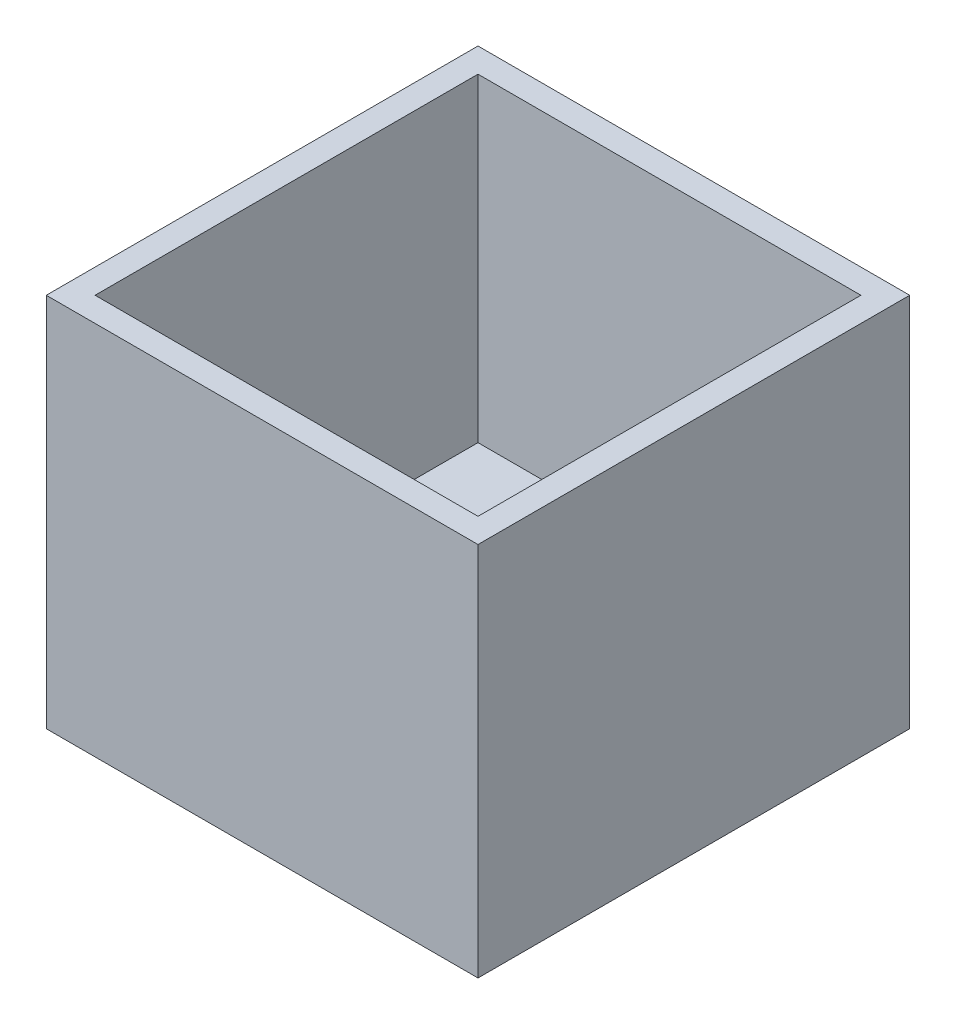
ISO-10303-21;
HEADER;
FILE_DESCRIPTION(('STEP AP214'),'2;1');
FILE_NAME('part.step','',(''),(''),'','','');
FILE_SCHEMA(('AUTOMOTIVE_DESIGN { 1 0 10303 214 1 1 1 1 }'));
ENDSEC;
DATA;
#1=APPLICATION_CONTEXT('core data for automotive mechanical design processes');
#2=APPLICATION_PROTOCOL_DEFINITION('international standard','automotive_design',2000,#1);
#3=PRODUCT_CONTEXT('',#1,'mechanical');
#4=PRODUCT('Part','Part','',(#3));
#5=PRODUCT_RELATED_PRODUCT_CATEGORY('part','',(#4));
#6=PRODUCT_DEFINITION_FORMATION('','',#4);
#7=PRODUCT_DEFINITION_CONTEXT('part definition',#1,'design');
#8=PRODUCT_DEFINITION('design','',#6,#7);
#9=PRODUCT_DEFINITION_SHAPE('','',#8);
#10=(LENGTH_UNIT() NAMED_UNIT(*) SI_UNIT(.MILLI.,.METRE.));
#11=(NAMED_UNIT(*) PLANE_ANGLE_UNIT() SI_UNIT($,.RADIAN.));
#12=(NAMED_UNIT(*) SI_UNIT($,.STERADIAN.) SOLID_ANGLE_UNIT());
#13=UNCERTAINTY_MEASURE_WITH_UNIT(LENGTH_MEASURE(1.E-05),#10,'distance_accuracy_value','');
#14=(GEOMETRIC_REPRESENTATION_CONTEXT(3) GLOBAL_UNCERTAINTY_ASSIGNED_CONTEXT((#13)) GLOBAL_UNIT_ASSIGNED_CONTEXT((#10,
#11,#12)) REPRESENTATION_CONTEXT('',''));
#15=CARTESIAN_POINT('',(0.,0.,0.));
#16=DIRECTION('',(0.,0.,1.));
#17=DIRECTION('',(1.,0.,0.));
#18=AXIS2_PLACEMENT_3D('',#15,#16,#17);
#19=CARTESIAN_POINT('',(11.5,20.,11.5));
#20=DIRECTION('',(-1.,0.,0.));
#21=DIRECTION('',(0.,0.,1.));
#22=AXIS2_PLACEMENT_3D('',#19,#20,#21);
#23=PLANE('',#22);
#24=DIRECTION('',(0.,0.,-1.));
#25=VECTOR('',#24,1.);
#26=CARTESIAN_POINT('',(11.5,0.,11.5));
#27=LINE('',#26,#25);
#28=CARTESIAN_POINT('',(11.5,0.,11.5));
#29=VERTEX_POINT('',#28);
#30=CARTESIAN_POINT('',(11.5,0.,-11.5));
#31=VERTEX_POINT('',#30);
#32=EDGE_CURVE('E146',#29,#31,#27,.T.);
#33=ORIENTED_EDGE('',*,*,#32,.T.);
#34=DIRECTION('',(0.,-1.,0.));
#35=VECTOR('',#34,1.);
#36=CARTESIAN_POINT('',(11.5,20.,-11.5));
#37=LINE('',#36,#35);
#38=CARTESIAN_POINT('',(11.5,20.,-11.5));
#39=VERTEX_POINT('',#38);
#40=EDGE_CURVE('E12',#39,#31,#37,.T.);
#41=ORIENTED_EDGE('',*,*,#40,.F.);
#42=DIRECTION('',(0.,0.,-1.));
#43=VECTOR('',#42,1.);
#44=CARTESIAN_POINT('',(11.5,20.,11.5));
#45=LINE('',#44,#43);
#46=CARTESIAN_POINT('',(11.5,20.,11.5));
#47=VERTEX_POINT('',#46);
#48=EDGE_CURVE('E147',#47,#39,#45,.T.);
#49=ORIENTED_EDGE('',*,*,#48,.F.);
#50=DIRECTION('',(0.,-1.,0.));
#51=VECTOR('',#50,1.);
#52=CARTESIAN_POINT('',(11.5,20.,11.5));
#53=LINE('',#52,#51);
#54=EDGE_CURVE('E153',#47,#29,#53,.T.);
#55=ORIENTED_EDGE('',*,*,#54,.T.);
#56=EDGE_LOOP('',(#33,#41,#49,#55));
#57=FACE_BOUND('',#56,.T.);
#58=ADVANCED_FACE('F35',(#57),#23,.F.);
#59=CARTESIAN_POINT('',(-11.5,20.,-11.5));
#60=DIRECTION('',(0.,0.,1.));
#61=DIRECTION('',(1.,0.,0.));
#62=AXIS2_PLACEMENT_3D('',#59,#60,#61);
#63=PLANE('',#62);
#64=DIRECTION('',(-1.,0.,0.));
#65=VECTOR('',#64,1.);
#66=CARTESIAN_POINT('',(-11.5,0.,-11.5));
#67=LINE('',#66,#65);
#68=CARTESIAN_POINT('',(-11.5,0.,-11.5));
#69=VERTEX_POINT('',#68);
#70=EDGE_CURVE('E156',#31,#69,#67,.T.);
#71=ORIENTED_EDGE('',*,*,#70,.T.);
#72=DIRECTION('',(0.,-1.,0.));
#73=VECTOR('',#72,1.);
#74=CARTESIAN_POINT('',(-11.5,20.,-11.5));
#75=LINE('',#74,#73);
#76=CARTESIAN_POINT('',(-11.5,20.,-11.5));
#77=VERTEX_POINT('',#76);
#78=EDGE_CURVE('E42',#77,#69,#75,.T.);
#79=ORIENTED_EDGE('',*,*,#78,.F.);
#80=DIRECTION('',(-1.,0.,0.));
#81=VECTOR('',#80,1.);
#82=CARTESIAN_POINT('',(-11.5,20.,-11.5));
#83=LINE('',#82,#81);
#84=EDGE_CURVE('E86',#39,#77,#83,.T.);
#85=ORIENTED_EDGE('',*,*,#84,.F.);
#86=ORIENTED_EDGE('',*,*,#40,.T.);
#87=EDGE_LOOP('',(#71,#79,#85,#86));
#88=FACE_BOUND('',#87,.T.);
#89=ADVANCED_FACE('F185',(#88),#63,.F.);
#90=CARTESIAN_POINT('',(-11.5,20.,11.5));
#91=DIRECTION('',(1.,0.,0.));
#92=DIRECTION('',(0.,0.,-1.));
#93=AXIS2_PLACEMENT_3D('',#90,#91,#92);
#94=PLANE('',#93);
#95=DIRECTION('',(0.,0.,1.));
#96=VECTOR('',#95,1.);
#97=CARTESIAN_POINT('',(-11.5,0.,11.5));
#98=LINE('',#97,#96);
#99=CARTESIAN_POINT('',(-11.5,0.,11.5));
#100=VERTEX_POINT('',#99);
#101=EDGE_CURVE('E158',#69,#100,#98,.T.);
#102=ORIENTED_EDGE('',*,*,#101,.T.);
#103=DIRECTION('',(0.,-1.,0.));
#104=VECTOR('',#103,1.);
#105=CARTESIAN_POINT('',(-11.5,20.,11.5));
#106=LINE('',#105,#104);
#107=CARTESIAN_POINT('',(-11.5,20.,11.5));
#108=VERTEX_POINT('',#107);
#109=EDGE_CURVE('E162',#108,#100,#106,.T.);
#110=ORIENTED_EDGE('',*,*,#109,.F.);
#111=DIRECTION('',(0.,0.,1.));
#112=VECTOR('',#111,1.);
#113=CARTESIAN_POINT('',(-11.5,20.,11.5));
#114=LINE('',#113,#112);
#115=EDGE_CURVE('E150',#77,#108,#114,.T.);
#116=ORIENTED_EDGE('',*,*,#115,.F.);
#117=ORIENTED_EDGE('',*,*,#78,.T.);
#118=EDGE_LOOP('',(#102,#110,#116,#117));
#119=FACE_BOUND('',#118,.T.);
#120=ADVANCED_FACE('F167',(#119),#94,.F.);
#121=CARTESIAN_POINT('',(-11.5,20.,11.5));
#122=DIRECTION('',(0.,0.,-1.));
#123=DIRECTION('',(-1.,0.,0.));
#124=AXIS2_PLACEMENT_3D('',#121,#122,#123);
#125=PLANE('',#124);
#126=DIRECTION('',(1.,0.,0.));
#127=VECTOR('',#126,1.);
#128=CARTESIAN_POINT('',(-11.5,0.,11.5));
#129=LINE('',#128,#127);
#130=EDGE_CURVE('E79',#100,#29,#129,.T.);
#131=ORIENTED_EDGE('',*,*,#130,.T.);
#132=ORIENTED_EDGE('',*,*,#54,.F.);
#133=DIRECTION('',(1.,0.,0.));
#134=VECTOR('',#133,1.);
#135=CARTESIAN_POINT('',(-11.5,20.,11.5));
#136=LINE('',#135,#134);
#137=EDGE_CURVE('E58',#108,#47,#136,.T.);
#138=ORIENTED_EDGE('',*,*,#137,.F.);
#139=ORIENTED_EDGE('',*,*,#109,.T.);
#140=EDGE_LOOP('',(#131,#132,#138,#139));
#141=FACE_BOUND('',#140,.T.);
#142=ADVANCED_FACE('F175',(#141),#125,.F.);
#143=CARTESIAN_POINT('',(0.,20.,0.));
#144=DIRECTION('',(0.,-1.,0.));
#145=DIRECTION('',(0.,0.,-1.));
#146=AXIS2_PLACEMENT_3D('',#143,#144,#145);
#147=PLANE('',#146);
#148=DIRECTION('',(-1.,0.,0.));
#149=VECTOR('',#148,1.);
#150=CARTESIAN_POINT('',(-10.2,20.,-10.2));
#151=LINE('',#150,#149);
#152=CARTESIAN_POINT('',(10.2,20.,-10.2));
#153=VERTEX_POINT('',#152);
#154=CARTESIAN_POINT('',(-10.2,20.,-10.2));
#155=VERTEX_POINT('',#154);
#156=EDGE_CURVE('E132',#153,#155,#151,.T.);
#157=ORIENTED_EDGE('',*,*,#156,.F.);
#158=DIRECTION('',(0.,0.,-1.));
#159=VECTOR('',#158,1.);
#160=CARTESIAN_POINT('',(10.2,20.,10.2));
#161=LINE('',#160,#159);
#162=CARTESIAN_POINT('',(10.2,20.,10.2));
#163=VERTEX_POINT('',#162);
#164=EDGE_CURVE('E125',#163,#153,#161,.T.);
#165=ORIENTED_EDGE('',*,*,#164,.F.);
#166=DIRECTION('',(1.,0.,0.));
#167=VECTOR('',#166,1.);
#168=CARTESIAN_POINT('',(-10.2,20.,10.2));
#169=LINE('',#168,#167);
#170=CARTESIAN_POINT('',(-10.2,20.,10.2));
#171=VERTEX_POINT('',#170);
#172=EDGE_CURVE('E136',#171,#163,#169,.T.);
#173=ORIENTED_EDGE('',*,*,#172,.F.);
#174=DIRECTION('',(0.,0.,1.));
#175=VECTOR('',#174,1.);
#176=CARTESIAN_POINT('',(-10.2,20.,10.2));
#177=LINE('',#176,#175);
#178=EDGE_CURVE('E49',#155,#171,#177,.T.);
#179=ORIENTED_EDGE('',*,*,#178,.F.);
#180=EDGE_LOOP('',(#157,#165,#173,#179));
#181=FACE_BOUND('',#180,.T.);
#182=ORIENTED_EDGE('',*,*,#48,.T.);
#183=ORIENTED_EDGE('',*,*,#84,.T.);
#184=ORIENTED_EDGE('',*,*,#115,.T.);
#185=ORIENTED_EDGE('',*,*,#137,.T.);
#186=EDGE_LOOP('',(#182,#183,#184,#185));
#187=FACE_BOUND('',#186,.T.);
#188=ADVANCED_FACE('F177',(#181,#187),#147,.F.);
#189=CARTESIAN_POINT('',(0.,0.,0.));
#190=DIRECTION('',(0.,-1.,0.));
#191=DIRECTION('',(0.,0.,-1.));
#192=AXIS2_PLACEMENT_3D('',#189,#190,#191);
#193=PLANE('',#192);
#194=ORIENTED_EDGE('',*,*,#32,.F.);
#195=ORIENTED_EDGE('',*,*,#130,.F.);
#196=ORIENTED_EDGE('',*,*,#101,.F.);
#197=ORIENTED_EDGE('',*,*,#70,.F.);
#198=EDGE_LOOP('',(#194,#195,#196,#197));
#199=FACE_BOUND('',#198,.T.);
#200=ADVANCED_FACE('F171',(#199),#193,.T.);
#201=CARTESIAN_POINT('',(0.,3.,0.));
#202=DIRECTION('',(0.,-1.,0.));
#203=DIRECTION('',(0.,0.,-1.));
#204=AXIS2_PLACEMENT_3D('',#201,#202,#203);
#205=PLANE('',#204);
#206=DIRECTION('',(1.,0.,0.));
#207=VECTOR('',#206,1.);
#208=CARTESIAN_POINT('',(-10.2,3.,10.2));
#209=LINE('',#208,#207);
#210=CARTESIAN_POINT('',(-10.2,3.,10.2));
#211=VERTEX_POINT('',#210);
#212=CARTESIAN_POINT('',(10.2,3.,10.2));
#213=VERTEX_POINT('',#212);
#214=EDGE_CURVE('E129',#211,#213,#209,.T.);
#215=ORIENTED_EDGE('',*,*,#214,.T.);
#216=DIRECTION('',(0.,0.,-1.));
#217=VECTOR('',#216,1.);
#218=CARTESIAN_POINT('',(10.2,3.,10.2));
#219=LINE('',#218,#217);
#220=CARTESIAN_POINT('',(10.2,3.,-10.2));
#221=VERTEX_POINT('',#220);
#222=EDGE_CURVE('E122',#213,#221,#219,.T.);
#223=ORIENTED_EDGE('',*,*,#222,.T.);
#224=DIRECTION('',(-1.,0.,0.));
#225=VECTOR('',#224,1.);
#226=CARTESIAN_POINT('',(-10.2,3.,-10.2));
#227=LINE('',#226,#225);
#228=CARTESIAN_POINT('',(-10.2,3.,-10.2));
#229=VERTEX_POINT('',#228);
#230=EDGE_CURVE('E109',#221,#229,#227,.T.);
#231=ORIENTED_EDGE('',*,*,#230,.T.);
#232=DIRECTION('',(0.,0.,1.));
#233=VECTOR('',#232,1.);
#234=CARTESIAN_POINT('',(-10.2,3.,10.2));
#235=LINE('',#234,#233);
#236=EDGE_CURVE('E141',#229,#211,#235,.T.);
#237=ORIENTED_EDGE('',*,*,#236,.T.);
#238=EDGE_LOOP('',(#215,#223,#231,#237));
#239=FACE_BOUND('',#238,.T.);
#240=ADVANCED_FACE('F128',(#239),#205,.F.);
#241=CARTESIAN_POINT('',(10.2,-28.8499566724111,10.2));
#242=DIRECTION('',(1.,0.,0.));
#243=DIRECTION('',(0.,0.,-1.));
#244=AXIS2_PLACEMENT_3D('',#241,#242,#243);
#245=PLANE('',#244);
#246=DIRECTION('',(0.,1.,0.));
#247=VECTOR('',#246,1.);
#248=CARTESIAN_POINT('',(10.2,-28.8499566724111,10.2));
#249=LINE('',#248,#247);
#250=EDGE_CURVE('E139',#213,#163,#249,.T.);
#251=ORIENTED_EDGE('',*,*,#250,.T.);
#252=ORIENTED_EDGE('',*,*,#164,.T.);
#253=DIRECTION('',(0.,1.,0.));
#254=VECTOR('',#253,1.);
#255=CARTESIAN_POINT('',(10.2,-28.8499566724111,-10.2));
#256=LINE('',#255,#254);
#257=EDGE_CURVE('E113',#221,#153,#256,.T.);
#258=ORIENTED_EDGE('',*,*,#257,.F.);
#259=ORIENTED_EDGE('',*,*,#222,.F.);
#260=EDGE_LOOP('',(#251,#252,#258,#259));
#261=FACE_BOUND('',#260,.T.);
#262=ADVANCED_FACE('F121',(#261),#245,.F.);
#263=CARTESIAN_POINT('',(-10.2,-28.8499566724111,-10.2));
#264=DIRECTION('',(0.,0.,-1.));
#265=DIRECTION('',(-1.,0.,0.));
#266=AXIS2_PLACEMENT_3D('',#263,#264,#265);
#267=PLANE('',#266);
#268=ORIENTED_EDGE('',*,*,#257,.T.);
#269=ORIENTED_EDGE('',*,*,#156,.T.);
#270=DIRECTION('',(0.,1.,0.));
#271=VECTOR('',#270,1.);
#272=CARTESIAN_POINT('',(-10.2,-28.8499566724111,-10.2));
#273=LINE('',#272,#271);
#274=EDGE_CURVE('E115',#229,#155,#273,.T.);
#275=ORIENTED_EDGE('',*,*,#274,.F.);
#276=ORIENTED_EDGE('',*,*,#230,.F.);
#277=EDGE_LOOP('',(#268,#269,#275,#276));
#278=FACE_BOUND('',#277,.T.);
#279=ADVANCED_FACE('F111',(#278),#267,.F.);
#280=CARTESIAN_POINT('',(-10.2,-28.8499566724111,10.2));
#281=DIRECTION('',(-1.,0.,0.));
#282=DIRECTION('',(0.,0.,1.));
#283=AXIS2_PLACEMENT_3D('',#280,#281,#282);
#284=PLANE('',#283);
#285=ORIENTED_EDGE('',*,*,#274,.T.);
#286=ORIENTED_EDGE('',*,*,#178,.T.);
#287=DIRECTION('',(0.,1.,0.));
#288=VECTOR('',#287,1.);
#289=CARTESIAN_POINT('',(-10.2,-28.8499566724111,10.2));
#290=LINE('',#289,#288);
#291=EDGE_CURVE('E140',#211,#171,#290,.T.);
#292=ORIENTED_EDGE('',*,*,#291,.F.);
#293=ORIENTED_EDGE('',*,*,#236,.F.);
#294=EDGE_LOOP('',(#285,#286,#292,#293));
#295=FACE_BOUND('',#294,.T.);
#296=ADVANCED_FACE('F240',(#295),#284,.F.);
#297=CARTESIAN_POINT('',(-10.2,-28.8499566724111,10.2));
#298=DIRECTION('',(0.,0.,1.));
#299=DIRECTION('',(1.,0.,0.));
#300=AXIS2_PLACEMENT_3D('',#297,#298,#299);
#301=PLANE('',#300);
#302=ORIENTED_EDGE('',*,*,#291,.T.);
#303=ORIENTED_EDGE('',*,*,#172,.T.);
#304=ORIENTED_EDGE('',*,*,#250,.F.);
#305=ORIENTED_EDGE('',*,*,#214,.F.);
#306=EDGE_LOOP('',(#302,#303,#304,#305));
#307=FACE_BOUND('',#306,.T.);
#308=ADVANCED_FACE('F249',(#307),#301,.F.);
#309=CLOSED_SHELL('',(#58,#89,#120,#142,#188,#200,#240,#262,#279,#296,#308));
#310=MANIFOLD_SOLID_BREP('B2',#309);
#311=ADVANCED_BREP_SHAPE_REPRESENTATION('',(#18,#310),#14);
#312=SHAPE_DEFINITION_REPRESENTATION(#9,#311);
ENDSEC;
END-ISO-10303-21;
